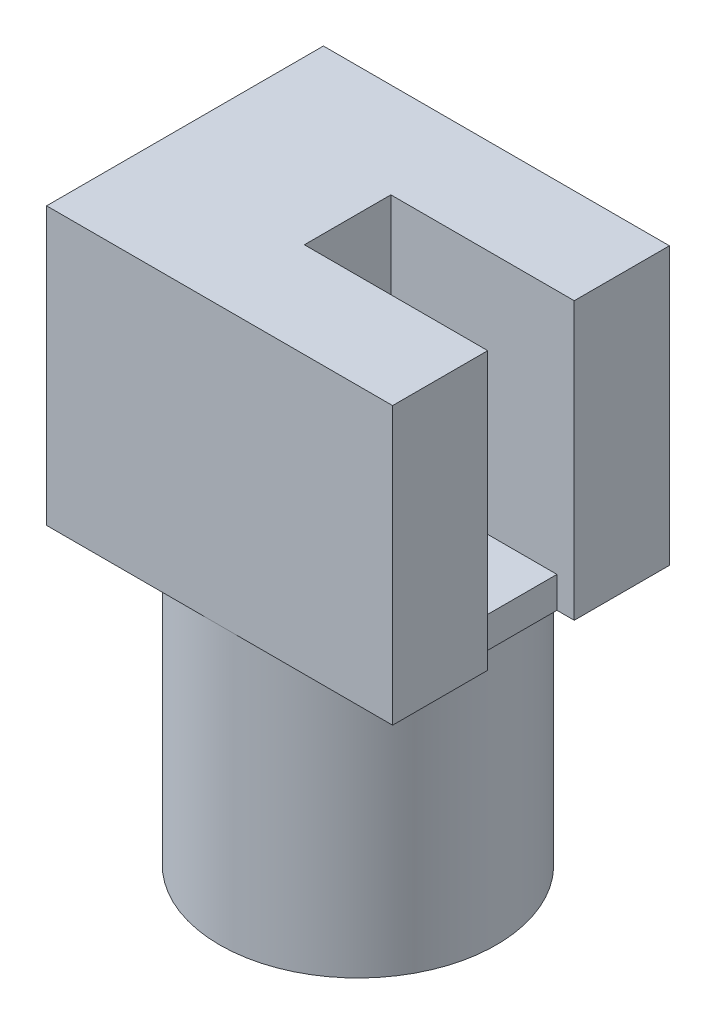
ISO-10303-21;
HEADER;
FILE_DESCRIPTION(('STEP AP214'),'2;1');
FILE_NAME('part.step','',(''),(''),'','','');
FILE_SCHEMA(('AUTOMOTIVE_DESIGN { 1 0 10303 214 1 1 1 1 }'));
ENDSEC;
DATA;
#1=APPLICATION_CONTEXT('core data for automotive mechanical design processes');
#2=APPLICATION_PROTOCOL_DEFINITION('international standard','automotive_design',2000,#1);
#3=PRODUCT_CONTEXT('',#1,'mechanical');
#4=PRODUCT('Part','Part','',(#3));
#5=PRODUCT_RELATED_PRODUCT_CATEGORY('part','',(#4));
#6=PRODUCT_DEFINITION_FORMATION('','',#4);
#7=PRODUCT_DEFINITION_CONTEXT('part definition',#1,'design');
#8=PRODUCT_DEFINITION('design','',#6,#7);
#9=PRODUCT_DEFINITION_SHAPE('','',#8);
#10=(LENGTH_UNIT() NAMED_UNIT(*) SI_UNIT(.MILLI.,.METRE.));
#11=(NAMED_UNIT(*) PLANE_ANGLE_UNIT() SI_UNIT($,.RADIAN.));
#12=(NAMED_UNIT(*) SI_UNIT($,.STERADIAN.) SOLID_ANGLE_UNIT());
#13=UNCERTAINTY_MEASURE_WITH_UNIT(LENGTH_MEASURE(1.E-05),#10,'distance_accuracy_value','');
#14=(GEOMETRIC_REPRESENTATION_CONTEXT(3) GLOBAL_UNCERTAINTY_ASSIGNED_CONTEXT((#13)) GLOBAL_UNIT_ASSIGNED_CONTEXT((#10,
#11,#12)) REPRESENTATION_CONTEXT('',''));
#15=CARTESIAN_POINT('',(0.,0.,0.));
#16=DIRECTION('',(0.,0.,1.));
#17=DIRECTION('',(1.,0.,0.));
#18=AXIS2_PLACEMENT_3D('',#15,#16,#17);
#19=CARTESIAN_POINT('',(25.,0.,0.));
#20=DIRECTION('',(-1.,0.,0.));
#21=DIRECTION('',(0.,0.,1.));
#22=AXIS2_PLACEMENT_3D('',#19,#20,#21);
#23=PLANE('',#22);
#24=DIRECTION('',(0.,0.,1.));
#25=VECTOR('',#24,1.);
#26=CARTESIAN_POINT('',(25.,80.,-20.));
#27=LINE('',#26,#25);
#28=CARTESIAN_POINT('',(25.,80.,-20.));
#29=VERTEX_POINT('',#28);
#30=CARTESIAN_POINT('',(25.,80.,-6.25));
#31=VERTEX_POINT('',#30);
#32=EDGE_CURVE('E201',#29,#31,#27,.T.);
#33=ORIENTED_EDGE('',*,*,#32,.T.);
#34=DIRECTION('',(0.,1.,0.));
#35=VECTOR('',#34,1.);
#36=CARTESIAN_POINT('',(25.,80.,-6.25));
#37=LINE('',#36,#35);
#38=CARTESIAN_POINT('',(25.,40.,-6.25));
#39=VERTEX_POINT('',#38);
#40=EDGE_CURVE('E134',#39,#31,#37,.T.);
#41=ORIENTED_EDGE('',*,*,#40,.F.);
#42=DIRECTION('',(0.,0.,-1.));
#43=VECTOR('',#42,1.);
#44=CARTESIAN_POINT('',(25.,40.,-20.));
#45=LINE('',#44,#43);
#46=CARTESIAN_POINT('',(25.,40.,-20.));
#47=VERTEX_POINT('',#46);
#48=EDGE_CURVE('E207',#39,#47,#45,.T.);
#49=ORIENTED_EDGE('',*,*,#48,.T.);
#50=DIRECTION('',(0.,1.,0.));
#51=VECTOR('',#50,1.);
#52=CARTESIAN_POINT('',(25.,80.,-20.));
#53=LINE('',#52,#51);
#54=EDGE_CURVE('E195',#47,#29,#53,.T.);
#55=ORIENTED_EDGE('',*,*,#54,.T.);
#56=EDGE_LOOP('',(#33,#41,#49,#55));
#57=FACE_BOUND('',#56,.T.);
#58=ADVANCED_FACE('F45',(#57),#23,.F.);
#59=CARTESIAN_POINT('',(0.,40.,0.));
#60=DIRECTION('',(0.,-1.,0.));
#61=DIRECTION('',(0.,0.,-1.));
#62=AXIS2_PLACEMENT_3D('',#59,#60,#61);
#63=CYLINDRICAL_SURFACE('',#62,20.);
#64=CARTESIAN_POINT('',(0.,40.,0.));
#65=DIRECTION('',(0.,1.,0.));
#66=DIRECTION('',(0.,0.,1.));
#67=AXIS2_PLACEMENT_3D('',#64,#65,#66);
#68=CIRCLE('',#67,20.);
#69=CARTESIAN_POINT('',(0.,40.,20.));
#70=VERTEX_POINT('',#69);
#71=CARTESIAN_POINT('',(0.,40.,-20.));
#72=VERTEX_POINT('',#71);
#73=EDGE_CURVE('E11',#70,#72,#68,.T.);
#74=ORIENTED_EDGE('',*,*,#73,.F.);
#75=EDGE_CURVE('E55',#72,#70,#68,.T.);
#76=ORIENTED_EDGE('',*,*,#75,.F.);
#77=EDGE_LOOP('',(#74,#76));
#78=FACE_BOUND('',#77,.T.);
#79=CARTESIAN_POINT('',(0.,0.,0.));
#80=DIRECTION('',(0.,1.,0.));
#81=DIRECTION('',(0.,0.,1.));
#82=AXIS2_PLACEMENT_3D('',#79,#80,#81);
#83=CIRCLE('',#82,20.);
#84=CARTESIAN_POINT('',(0.,0.,20.));
#85=VERTEX_POINT('',#84);
#86=EDGE_CURVE('E49',#85,#85,#83,.T.);
#87=ORIENTED_EDGE('',*,*,#86,.T.);
#88=EDGE_LOOP('',(#87));
#89=FACE_BOUND('',#88,.T.);
#90=ADVANCED_FACE('F47',(#78,#89),#63,.T.);
#91=CARTESIAN_POINT('',(0.,0.,0.));
#92=DIRECTION('',(0.,1.,0.));
#93=DIRECTION('',(0.,0.,1.));
#94=AXIS2_PLACEMENT_3D('',#91,#92,#93);
#95=PLANE('',#94);
#96=CARTESIAN_POINT('',(0.,0.,0.));
#97=DIRECTION('',(0.,-1.,0.));
#98=DIRECTION('',(0.,0.,-1.));
#99=AXIS2_PLACEMENT_3D('',#96,#97,#98);
#100=CIRCLE('',#99,2.7);
#101=CARTESIAN_POINT('',(0.,0.,-2.7));
#102=VERTEX_POINT('',#101);
#103=EDGE_CURVE('E243',#102,#102,#100,.T.);
#104=ORIENTED_EDGE('',*,*,#103,.F.);
#105=EDGE_LOOP('',(#104));
#106=FACE_BOUND('',#105,.T.);
#107=ORIENTED_EDGE('',*,*,#86,.F.);
#108=EDGE_LOOP('',(#107));
#109=FACE_BOUND('',#108,.T.);
#110=ADVANCED_FACE('F254',(#106,#109),#95,.F.);
#111=CARTESIAN_POINT('',(0.,3.5,0.));
#112=DIRECTION('',(0.,-1.,0.));
#113=DIRECTION('',(0.,0.,-1.));
#114=AXIS2_PLACEMENT_3D('',#111,#112,#113);
#115=CYLINDRICAL_SURFACE('',#114,2.7);
#116=CARTESIAN_POINT('',(0.,3.5,0.));
#117=DIRECTION('',(0.,-1.,0.));
#118=DIRECTION('',(0.,0.,-1.));
#119=AXIS2_PLACEMENT_3D('',#116,#117,#118);
#120=CIRCLE('',#119,2.7);
#121=CARTESIAN_POINT('',(0.,3.5,-2.7));
#122=VERTEX_POINT('',#121);
#123=EDGE_CURVE('E244',#122,#122,#120,.T.);
#124=ORIENTED_EDGE('',*,*,#123,.F.);
#125=EDGE_LOOP('',(#124));
#126=FACE_BOUND('',#125,.T.);
#127=ORIENTED_EDGE('',*,*,#103,.T.);
#128=EDGE_LOOP('',(#127));
#129=FACE_BOUND('',#128,.T.);
#130=ADVANCED_FACE('F252',(#126,#129),#115,.F.);
#131=CARTESIAN_POINT('',(0.,3.5,0.));
#132=DIRECTION('',(0.,-1.,0.));
#133=DIRECTION('',(0.,0.,-1.));
#134=AXIS2_PLACEMENT_3D('',#131,#132,#133);
#135=PLANE('',#134);
#136=ORIENTED_EDGE('',*,*,#123,.T.);
#137=EDGE_LOOP('',(#136));
#138=FACE_BOUND('',#137,.T.);
#139=ADVANCED_FACE('F330',(#138),#135,.T.);
#140=CARTESIAN_POINT('',(25.,40.,-20.));
#141=DIRECTION('',(0.,1.,0.));
#142=DIRECTION('',(0.,0.,1.));
#143=AXIS2_PLACEMENT_3D('',#140,#141,#142);
#144=PLANE('',#143);
#145=ORIENTED_EDGE('',*,*,#48,.F.);
#146=DIRECTION('',(1.,0.,0.));
#147=VECTOR('',#146,1.);
#148=CARTESIAN_POINT('',(22.5,40.,-6.25));
#149=LINE('',#148,#147);
#150=CARTESIAN_POINT('',(22.5,40.,-6.25));
#151=VERTEX_POINT('',#150);
#152=EDGE_CURVE('E185',#151,#39,#149,.T.);
#153=ORIENTED_EDGE('',*,*,#152,.F.);
#154=DIRECTION('',(0.,0.,-1.));
#155=VECTOR('',#154,1.);
#156=CARTESIAN_POINT('',(22.5,40.,-6.25));
#157=LINE('',#156,#155);
#158=CARTESIAN_POINT('',(22.5,40.,6.25));
#159=VERTEX_POINT('',#158);
#160=EDGE_CURVE('E139',#159,#151,#157,.T.);
#161=ORIENTED_EDGE('',*,*,#160,.F.);
#162=DIRECTION('',(1.,0.,0.));
#163=VECTOR('',#162,1.);
#164=CARTESIAN_POINT('',(22.5,40.,6.25));
#165=LINE('',#164,#163);
#166=CARTESIAN_POINT('',(25.,40.,6.25));
#167=VERTEX_POINT('',#166);
#168=EDGE_CURVE('E189',#159,#167,#165,.T.);
#169=ORIENTED_EDGE('',*,*,#168,.T.);
#170=CARTESIAN_POINT('',(25.,40.,20.));
#171=VERTEX_POINT('',#170);
#172=EDGE_CURVE('E208',#171,#167,#45,.T.);
#173=ORIENTED_EDGE('',*,*,#172,.F.);
#174=DIRECTION('',(-1.,0.,0.));
#175=VECTOR('',#174,1.);
#176=CARTESIAN_POINT('',(25.,40.,20.));
#177=LINE('',#176,#175);
#178=EDGE_CURVE('E231',#171,#70,#177,.T.);
#179=ORIENTED_EDGE('',*,*,#178,.T.);
#180=ORIENTED_EDGE('',*,*,#73,.T.);
#181=DIRECTION('',(-1.,0.,0.));
#182=VECTOR('',#181,1.);
#183=CARTESIAN_POINT('',(25.,40.,-20.));
#184=LINE('',#183,#182);
#185=EDGE_CURVE('E226',#47,#72,#184,.T.);
#186=ORIENTED_EDGE('',*,*,#185,.F.);
#187=EDGE_LOOP('',(#145,#153,#161,#169,#173,#179,#180,#186));
#188=FACE_BOUND('',#187,.T.);
#189=ADVANCED_FACE('F276',(#188),#144,.F.);
#190=CARTESIAN_POINT('',(-25.,40.,-20.));
#191=VERTEX_POINT('',#190);
#192=EDGE_CURVE('E212',#72,#191,#184,.T.);
#193=ORIENTED_EDGE('',*,*,#192,.F.);
#194=ORIENTED_EDGE('',*,*,#75,.T.);
#195=CARTESIAN_POINT('',(-25.,40.,20.));
#196=VERTEX_POINT('',#195);
#197=EDGE_CURVE('E230',#70,#196,#177,.T.);
#198=ORIENTED_EDGE('',*,*,#197,.T.);
#199=DIRECTION('',(0.,0.,-1.));
#200=VECTOR('',#199,1.);
#201=CARTESIAN_POINT('',(-25.,40.,-20.));
#202=LINE('',#201,#200);
#203=EDGE_CURVE('E200',#196,#191,#202,.T.);
#204=ORIENTED_EDGE('',*,*,#203,.T.);
#205=EDGE_LOOP('',(#193,#194,#198,#204));
#206=FACE_BOUND('',#205,.T.);
#207=ADVANCED_FACE('F265',(#206),#144,.F.);
#208=CARTESIAN_POINT('',(25.,80.,-20.));
#209=DIRECTION('',(0.,0.,1.));
#210=DIRECTION('',(0.,-1.,0.));
#211=AXIS2_PLACEMENT_3D('',#208,#209,#210);
#212=PLANE('',#211);
#213=DIRECTION('',(0.,1.,0.));
#214=VECTOR('',#213,1.);
#215=CARTESIAN_POINT('',(-25.,80.,-20.));
#216=LINE('',#215,#214);
#217=CARTESIAN_POINT('',(-25.,80.,-20.));
#218=VERTEX_POINT('',#217);
#219=EDGE_CURVE('E188',#191,#218,#216,.T.);
#220=ORIENTED_EDGE('',*,*,#219,.T.);
#221=DIRECTION('',(-1.,0.,0.));
#222=VECTOR('',#221,1.);
#223=CARTESIAN_POINT('',(25.,80.,-20.));
#224=LINE('',#223,#222);
#225=EDGE_CURVE('E239',#29,#218,#224,.T.);
#226=ORIENTED_EDGE('',*,*,#225,.F.);
#227=ORIENTED_EDGE('',*,*,#54,.F.);
#228=ORIENTED_EDGE('',*,*,#185,.T.);
#229=ORIENTED_EDGE('',*,*,#192,.T.);
#230=EDGE_LOOP('',(#220,#226,#227,#228,#229));
#231=FACE_BOUND('',#230,.T.);
#232=ADVANCED_FACE('F288',(#231),#212,.F.);
#233=CARTESIAN_POINT('',(25.,80.,-20.));
#234=DIRECTION('',(0.,-1.,0.));
#235=DIRECTION('',(0.,0.,-1.));
#236=AXIS2_PLACEMENT_3D('',#233,#234,#235);
#237=PLANE('',#236);
#238=DIRECTION('',(0.,0.,1.));
#239=VECTOR('',#238,1.);
#240=CARTESIAN_POINT('',(-1.5,80.,-6.25));
#241=LINE('',#240,#239);
#242=CARTESIAN_POINT('',(-1.5,80.,-6.25));
#243=VERTEX_POINT('',#242);
#244=CARTESIAN_POINT('',(-1.5,80.,6.25));
#245=VERTEX_POINT('',#244);
#246=EDGE_CURVE('E145',#243,#245,#241,.T.);
#247=ORIENTED_EDGE('',*,*,#246,.F.);
#248=DIRECTION('',(1.,0.,0.));
#249=VECTOR('',#248,1.);
#250=CARTESIAN_POINT('',(22.5,80.,-6.25));
#251=LINE('',#250,#249);
#252=EDGE_CURVE('E128',#243,#31,#251,.T.);
#253=ORIENTED_EDGE('',*,*,#252,.T.);
#254=ORIENTED_EDGE('',*,*,#32,.F.);
#255=ORIENTED_EDGE('',*,*,#225,.T.);
#256=DIRECTION('',(0.,0.,1.));
#257=VECTOR('',#256,1.);
#258=CARTESIAN_POINT('',(-25.,80.,-20.));
#259=LINE('',#258,#257);
#260=CARTESIAN_POINT('',(-25.,80.,20.));
#261=VERTEX_POINT('',#260);
#262=EDGE_CURVE('E216',#218,#261,#259,.T.);
#263=ORIENTED_EDGE('',*,*,#262,.T.);
#264=DIRECTION('',(-1.,0.,0.));
#265=VECTOR('',#264,1.);
#266=CARTESIAN_POINT('',(25.,80.,20.));
#267=LINE('',#266,#265);
#268=CARTESIAN_POINT('',(25.,80.,20.));
#269=VERTEX_POINT('',#268);
#270=EDGE_CURVE('E235',#269,#261,#267,.T.);
#271=ORIENTED_EDGE('',*,*,#270,.F.);
#272=CARTESIAN_POINT('',(25.,80.,6.25));
#273=VERTEX_POINT('',#272);
#274=EDGE_CURVE('E199',#273,#269,#27,.T.);
#275=ORIENTED_EDGE('',*,*,#274,.F.);
#276=DIRECTION('',(1.,0.,0.));
#277=VECTOR('',#276,1.);
#278=CARTESIAN_POINT('',(22.5,80.,6.25));
#279=LINE('',#278,#277);
#280=EDGE_CURVE('E62',#245,#273,#279,.T.);
#281=ORIENTED_EDGE('',*,*,#280,.F.);
#282=EDGE_LOOP('',(#247,#253,#254,#255,#263,#271,#275,#281));
#283=FACE_BOUND('',#282,.T.);
#284=ADVANCED_FACE('F151',(#283),#237,.F.);
#285=CARTESIAN_POINT('',(25.,80.,20.));
#286=DIRECTION('',(0.,0.,-1.));
#287=DIRECTION('',(0.,1.,0.));
#288=AXIS2_PLACEMENT_3D('',#285,#286,#287);
#289=PLANE('',#288);
#290=DIRECTION('',(0.,-1.,0.));
#291=VECTOR('',#290,1.);
#292=CARTESIAN_POINT('',(-25.,80.,20.));
#293=LINE('',#292,#291);
#294=EDGE_CURVE('E219',#261,#196,#293,.T.);
#295=ORIENTED_EDGE('',*,*,#294,.T.);
#296=ORIENTED_EDGE('',*,*,#197,.F.);
#297=ORIENTED_EDGE('',*,*,#178,.F.);
#298=DIRECTION('',(0.,-1.,0.));
#299=VECTOR('',#298,1.);
#300=CARTESIAN_POINT('',(25.,80.,20.));
#301=LINE('',#300,#299);
#302=EDGE_CURVE('E204',#269,#171,#301,.T.);
#303=ORIENTED_EDGE('',*,*,#302,.F.);
#304=ORIENTED_EDGE('',*,*,#270,.T.);
#305=EDGE_LOOP('',(#295,#296,#297,#303,#304));
#306=FACE_BOUND('',#305,.T.);
#307=ADVANCED_FACE('F268',(#306),#289,.F.);
#308=ORIENTED_EDGE('',*,*,#172,.T.);
#309=DIRECTION('',(0.,-1.,0.));
#310=VECTOR('',#309,1.);
#311=CARTESIAN_POINT('',(25.,80.,6.25));
#312=LINE('',#311,#310);
#313=EDGE_CURVE('E175',#273,#167,#312,.T.);
#314=ORIENTED_EDGE('',*,*,#313,.F.);
#315=ORIENTED_EDGE('',*,*,#274,.T.);
#316=ORIENTED_EDGE('',*,*,#302,.T.);
#317=EDGE_LOOP('',(#308,#314,#315,#316));
#318=FACE_BOUND('',#317,.T.);
#319=ADVANCED_FACE('F281',(#318),#23,.F.);
#320=CARTESIAN_POINT('',(-25.,0.,0.));
#321=DIRECTION('',(-1.,0.,0.));
#322=DIRECTION('',(0.,0.,1.));
#323=AXIS2_PLACEMENT_3D('',#320,#321,#322);
#324=PLANE('',#323);
#325=ORIENTED_EDGE('',*,*,#219,.F.);
#326=ORIENTED_EDGE('',*,*,#203,.F.);
#327=ORIENTED_EDGE('',*,*,#294,.F.);
#328=ORIENTED_EDGE('',*,*,#262,.F.);
#329=EDGE_LOOP('',(#325,#326,#327,#328));
#330=FACE_BOUND('',#329,.T.);
#331=ADVANCED_FACE('F285',(#330),#324,.T.);
#332=CARTESIAN_POINT('',(22.5,80.,-6.25));
#333=DIRECTION('',(0.,0.,-1.));
#334=DIRECTION('',(0.,1.,0.));
#335=AXIS2_PLACEMENT_3D('',#332,#333,#334);
#336=PLANE('',#335);
#337=ORIENTED_EDGE('',*,*,#40,.T.);
#338=ORIENTED_EDGE('',*,*,#252,.F.);
#339=DIRECTION('',(0.,1.,0.));
#340=VECTOR('',#339,1.);
#341=CARTESIAN_POINT('',(-1.5,80.,-6.25));
#342=LINE('',#341,#340);
#343=CARTESIAN_POINT('',(-1.5,44.5,-6.25));
#344=VERTEX_POINT('',#343);
#345=EDGE_CURVE('E131',#344,#243,#342,.T.);
#346=ORIENTED_EDGE('',*,*,#345,.F.);
#347=DIRECTION('',(1.,0.,0.));
#348=VECTOR('',#347,1.);
#349=CARTESIAN_POINT('',(-1.5,44.5,-6.25));
#350=LINE('',#349,#348);
#351=CARTESIAN_POINT('',(22.5,44.5,-6.25));
#352=VERTEX_POINT('',#351);
#353=EDGE_CURVE('E165',#344,#352,#350,.T.);
#354=ORIENTED_EDGE('',*,*,#353,.T.);
#355=DIRECTION('',(0.,1.,0.));
#356=VECTOR('',#355,1.);
#357=CARTESIAN_POINT('',(22.5,80.,-6.25));
#358=LINE('',#357,#356);
#359=EDGE_CURVE('E170',#151,#352,#358,.T.);
#360=ORIENTED_EDGE('',*,*,#359,.F.);
#361=ORIENTED_EDGE('',*,*,#152,.T.);
#362=EDGE_LOOP('',(#337,#338,#346,#354,#360,#361));
#363=FACE_BOUND('',#362,.T.);
#364=ADVANCED_FACE('F130',(#363),#336,.F.);
#365=CARTESIAN_POINT('',(22.5,80.,6.25));
#366=DIRECTION('',(0.,0.,1.));
#367=DIRECTION('',(0.,-1.,0.));
#368=AXIS2_PLACEMENT_3D('',#365,#366,#367);
#369=PLANE('',#368);
#370=ORIENTED_EDGE('',*,*,#313,.T.);
#371=ORIENTED_EDGE('',*,*,#168,.F.);
#372=DIRECTION('',(0.,-1.,0.));
#373=VECTOR('',#372,1.);
#374=CARTESIAN_POINT('',(22.5,80.,6.25));
#375=LINE('',#374,#373);
#376=CARTESIAN_POINT('',(22.5,44.5,6.25));
#377=VERTEX_POINT('',#376);
#378=EDGE_CURVE('E174',#377,#159,#375,.T.);
#379=ORIENTED_EDGE('',*,*,#378,.F.);
#380=DIRECTION('',(1.,0.,0.));
#381=VECTOR('',#380,1.);
#382=CARTESIAN_POINT('',(-1.5,44.5,6.25));
#383=LINE('',#382,#381);
#384=CARTESIAN_POINT('',(-1.5,44.5,6.25));
#385=VERTEX_POINT('',#384);
#386=EDGE_CURVE('E161',#385,#377,#383,.T.);
#387=ORIENTED_EDGE('',*,*,#386,.F.);
#388=DIRECTION('',(0.,-1.,0.));
#389=VECTOR('',#388,1.);
#390=CARTESIAN_POINT('',(-1.5,80.,6.25));
#391=LINE('',#390,#389);
#392=EDGE_CURVE('E154',#245,#385,#391,.T.);
#393=ORIENTED_EDGE('',*,*,#392,.F.);
#394=ORIENTED_EDGE('',*,*,#280,.T.);
#395=EDGE_LOOP('',(#370,#371,#379,#387,#393,#394));
#396=FACE_BOUND('',#395,.T.);
#397=ADVANCED_FACE('F299',(#396),#369,.F.);
#398=CARTESIAN_POINT('',(22.5,0.,0.));
#399=DIRECTION('',(-1.,0.,0.));
#400=DIRECTION('',(0.,0.,1.));
#401=AXIS2_PLACEMENT_3D('',#398,#399,#400);
#402=PLANE('',#401);
#403=ORIENTED_EDGE('',*,*,#359,.T.);
#404=DIRECTION('',(0.,0.,-1.));
#405=VECTOR('',#404,1.);
#406=CARTESIAN_POINT('',(22.5,44.5,-6.25));
#407=LINE('',#406,#405);
#408=EDGE_CURVE('E149',#377,#352,#407,.T.);
#409=ORIENTED_EDGE('',*,*,#408,.F.);
#410=ORIENTED_EDGE('',*,*,#378,.T.);
#411=ORIENTED_EDGE('',*,*,#160,.T.);
#412=EDGE_LOOP('',(#403,#409,#410,#411));
#413=FACE_BOUND('',#412,.T.);
#414=ADVANCED_FACE('F297',(#413),#402,.F.);
#415=CARTESIAN_POINT('',(-1.5,44.5,-6.25));
#416=DIRECTION('',(0.,-1.,0.));
#417=DIRECTION('',(0.,0.,-1.));
#418=AXIS2_PLACEMENT_3D('',#415,#416,#417);
#419=PLANE('',#418);
#420=ORIENTED_EDGE('',*,*,#408,.T.);
#421=ORIENTED_EDGE('',*,*,#353,.F.);
#422=DIRECTION('',(0.,0.,-1.));
#423=VECTOR('',#422,1.);
#424=CARTESIAN_POINT('',(-1.5,44.5,-6.25));
#425=LINE('',#424,#423);
#426=EDGE_CURVE('E147',#385,#344,#425,.T.);
#427=ORIENTED_EDGE('',*,*,#426,.F.);
#428=ORIENTED_EDGE('',*,*,#386,.T.);
#429=EDGE_LOOP('',(#420,#421,#427,#428));
#430=FACE_BOUND('',#429,.T.);
#431=ADVANCED_FACE('F306',(#430),#419,.F.);
#432=CARTESIAN_POINT('',(-1.5,0.,0.));
#433=DIRECTION('',(-1.,0.,0.));
#434=DIRECTION('',(0.,0.,1.));
#435=AXIS2_PLACEMENT_3D('',#432,#433,#434);
#436=PLANE('',#435);
#437=ORIENTED_EDGE('',*,*,#345,.T.);
#438=ORIENTED_EDGE('',*,*,#246,.T.);
#439=ORIENTED_EDGE('',*,*,#392,.T.);
#440=ORIENTED_EDGE('',*,*,#426,.T.);
#441=EDGE_LOOP('',(#437,#438,#439,#440));
#442=FACE_BOUND('',#441,.T.);
#443=ADVANCED_FACE('F143',(#442),#436,.F.);
#444=CLOSED_SHELL('',(#58,#90,#110,#130,#139,#189,#207,#232,#284,#307,#319,#331,#364,#397,#414,
#431,#443));
#445=MANIFOLD_SOLID_BREP('B2',#444);
#446=ADVANCED_BREP_SHAPE_REPRESENTATION('',(#18,#445),#14);
#447=SHAPE_DEFINITION_REPRESENTATION(#9,#446);
ENDSEC;
END-ISO-10303-21;
